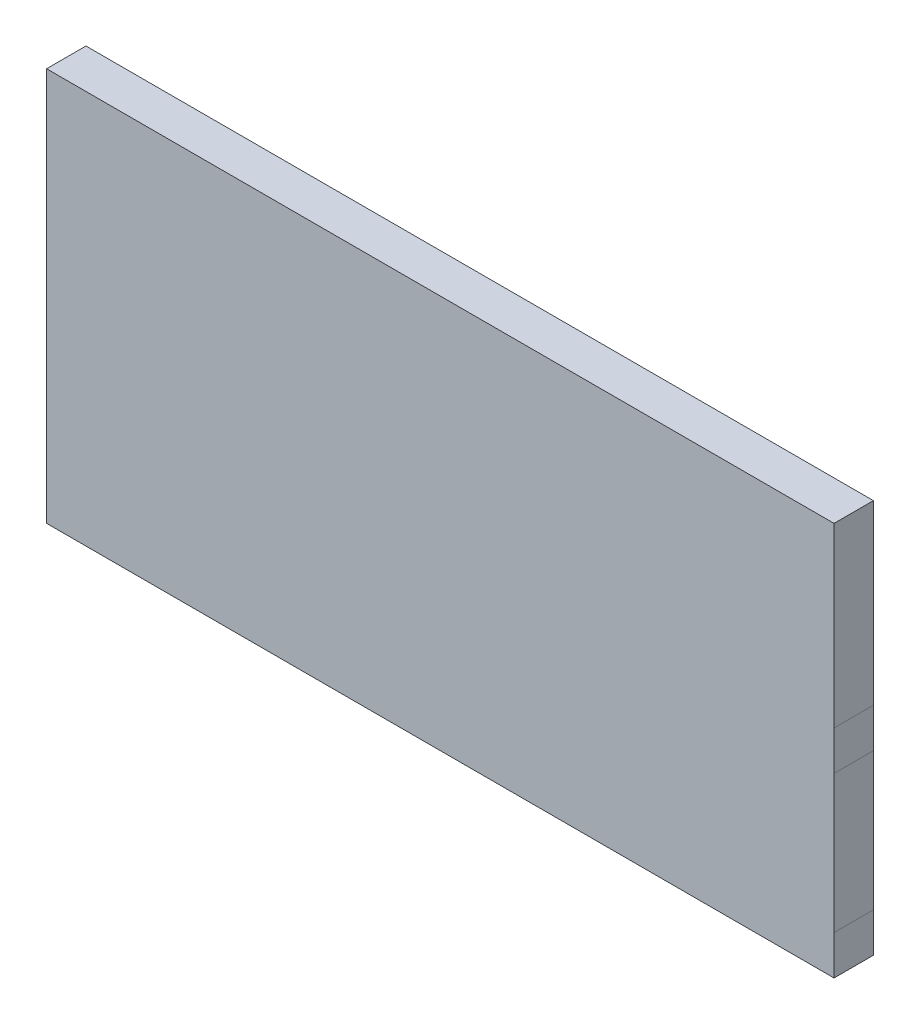
ISO-10303-21;
HEADER;
FILE_DESCRIPTION(('STEP AP214'),'2;1');
FILE_NAME('part.step','',(''),(''),'','','');
FILE_SCHEMA(('AUTOMOTIVE_DESIGN { 1 0 10303 214 1 1 1 1 }'));
ENDSEC;
DATA;
#1=APPLICATION_CONTEXT('core data for automotive mechanical design processes');
#2=APPLICATION_PROTOCOL_DEFINITION('international standard','automotive_design',2000,#1);
#3=PRODUCT_CONTEXT('',#1,'mechanical');
#4=PRODUCT('Part','Part','',(#3));
#5=PRODUCT_RELATED_PRODUCT_CATEGORY('part','',(#4));
#6=PRODUCT_DEFINITION_FORMATION('','',#4);
#7=PRODUCT_DEFINITION_CONTEXT('part definition',#1,'design');
#8=PRODUCT_DEFINITION('design','',#6,#7);
#9=PRODUCT_DEFINITION_SHAPE('','',#8);
#10=(LENGTH_UNIT() NAMED_UNIT(*) SI_UNIT(.MILLI.,.METRE.));
#11=(NAMED_UNIT(*) PLANE_ANGLE_UNIT() SI_UNIT($,.RADIAN.));
#12=(NAMED_UNIT(*) SI_UNIT($,.STERADIAN.) SOLID_ANGLE_UNIT());
#13=UNCERTAINTY_MEASURE_WITH_UNIT(LENGTH_MEASURE(1.E-05),#10,'distance_accuracy_value','');
#14=(GEOMETRIC_REPRESENTATION_CONTEXT(3) GLOBAL_UNCERTAINTY_ASSIGNED_CONTEXT((#13)) GLOBAL_UNIT_ASSIGNED_CONTEXT((#10,
#11,#12)) REPRESENTATION_CONTEXT('',''));
#15=CARTESIAN_POINT('',(0.,0.,0.));
#16=DIRECTION('',(0.,0.,1.));
#17=DIRECTION('',(1.,0.,0.));
#18=AXIS2_PLACEMENT_3D('',#15,#16,#17);
#19=CARTESIAN_POINT('',(2000.,0.,100.));
#20=DIRECTION('',(-1.,0.,0.));
#21=DIRECTION('',(0.,0.,1.));
#22=AXIS2_PLACEMENT_3D('',#19,#20,#21);
#23=PLANE('',#22);
#24=DIRECTION('',(0.,0.,-1.));
#25=VECTOR('',#24,1.);
#26=CARTESIAN_POINT('',(2000.,550.,100.));
#27=LINE('',#26,#25);
#28=CARTESIAN_POINT('',(2000.,550.,100.));
#29=VERTEX_POINT('',#28);
#30=CARTESIAN_POINT('',(2000.,550.,0.));
#31=VERTEX_POINT('',#30);
#32=EDGE_CURVE('E11',#29,#31,#27,.T.);
#33=ORIENTED_EDGE('',*,*,#32,.F.);
#34=DIRECTION('',(0.,1.,0.));
#35=VECTOR('',#34,1.);
#36=CARTESIAN_POINT('',(2000.,0.,100.));
#37=LINE('',#36,#35);
#38=CARTESIAN_POINT('',(2000.,450.,100.));
#39=VERTEX_POINT('',#38);
#40=EDGE_CURVE('E134',#39,#29,#37,.T.);
#41=ORIENTED_EDGE('',*,*,#40,.F.);
#42=DIRECTION('',(0.,0.,-1.));
#43=VECTOR('',#42,1.);
#44=CARTESIAN_POINT('',(2000.,450.,100.));
#45=LINE('',#44,#43);
#46=CARTESIAN_POINT('',(2000.,450.,0.));
#47=VERTEX_POINT('',#46);
#48=EDGE_CURVE('E48',#39,#47,#45,.T.);
#49=ORIENTED_EDGE('',*,*,#48,.T.);
#50=DIRECTION('',(0.,1.,0.));
#51=VECTOR('',#50,1.);
#52=CARTESIAN_POINT('',(2000.,0.,0.));
#53=LINE('',#52,#51);
#54=EDGE_CURVE('E132',#47,#31,#53,.T.);
#55=ORIENTED_EDGE('',*,*,#54,.T.);
#56=EDGE_LOOP('',(#33,#41,#49,#55));
#57=FACE_BOUND('',#56,.T.);
#58=ADVANCED_FACE('F39',(#57),#23,.F.);
#59=ORIENTED_EDGE('',*,*,#48,.F.);
#60=CARTESIAN_POINT('',(2000.,100.,100.));
#61=VERTEX_POINT('',#60);
#62=EDGE_CURVE('E163',#61,#39,#37,.T.);
#63=ORIENTED_EDGE('',*,*,#62,.F.);
#64=DIRECTION('',(0.,0.,-1.));
#65=VECTOR('',#64,1.);
#66=CARTESIAN_POINT('',(2000.,100.,100.));
#67=LINE('',#66,#65);
#68=CARTESIAN_POINT('',(2000.,100.,0.));
#69=VERTEX_POINT('',#68);
#70=EDGE_CURVE('E121',#61,#69,#67,.T.);
#71=ORIENTED_EDGE('',*,*,#70,.T.);
#72=EDGE_CURVE('E143',#69,#47,#53,.T.);
#73=ORIENTED_EDGE('',*,*,#72,.T.);
#74=EDGE_LOOP('',(#59,#63,#71,#73));
#75=FACE_BOUND('',#74,.T.);
#76=ADVANCED_FACE('F148',(#75),#23,.F.);
#77=ORIENTED_EDGE('',*,*,#70,.F.);
#78=CARTESIAN_POINT('',(2000.,0.,100.));
#79=VERTEX_POINT('',#78);
#80=EDGE_CURVE('E162',#79,#61,#37,.T.);
#81=ORIENTED_EDGE('',*,*,#80,.F.);
#82=DIRECTION('',(0.,0.,-1.));
#83=VECTOR('',#82,1.);
#84=CARTESIAN_POINT('',(2000.,0.,100.));
#85=LINE('',#84,#83);
#86=CARTESIAN_POINT('',(2000.,0.,0.));
#87=VERTEX_POINT('',#86);
#88=EDGE_CURVE('E103',#79,#87,#85,.T.);
#89=ORIENTED_EDGE('',*,*,#88,.T.);
#90=EDGE_CURVE('E149',#87,#69,#53,.T.);
#91=ORIENTED_EDGE('',*,*,#90,.T.);
#92=EDGE_LOOP('',(#77,#81,#89,#91));
#93=FACE_BOUND('',#92,.T.);
#94=ADVANCED_FACE('F167',(#93),#23,.F.);
#95=CARTESIAN_POINT('',(0.,0.,100.));
#96=DIRECTION('',(1.,0.,0.));
#97=DIRECTION('',(0.,0.,-1.));
#98=AXIS2_PLACEMENT_3D('',#95,#96,#97);
#99=PLANE('',#98);
#100=DIRECTION('',(0.,-1.,0.));
#101=VECTOR('',#100,1.);
#102=CARTESIAN_POINT('',(0.,0.,0.));
#103=LINE('',#102,#101);
#104=CARTESIAN_POINT('',(0.,1000.,0.));
#105=VERTEX_POINT('',#104);
#106=CARTESIAN_POINT('',(0.,0.,0.));
#107=VERTEX_POINT('',#106);
#108=EDGE_CURVE('E120',#105,#107,#103,.T.);
#109=ORIENTED_EDGE('',*,*,#108,.T.);
#110=DIRECTION('',(0.,0.,-1.));
#111=VECTOR('',#110,1.);
#112=CARTESIAN_POINT('',(0.,0.,100.));
#113=LINE('',#112,#111);
#114=CARTESIAN_POINT('',(0.,0.,100.));
#115=VERTEX_POINT('',#114);
#116=EDGE_CURVE('E100',#115,#107,#113,.T.);
#117=ORIENTED_EDGE('',*,*,#116,.F.);
#118=DIRECTION('',(0.,-1.,0.));
#119=VECTOR('',#118,1.);
#120=CARTESIAN_POINT('',(0.,0.,100.));
#121=LINE('',#120,#119);
#122=CARTESIAN_POINT('',(0.,1000.,100.));
#123=VERTEX_POINT('',#122);
#124=EDGE_CURVE('E108',#123,#115,#121,.T.);
#125=ORIENTED_EDGE('',*,*,#124,.F.);
#126=DIRECTION('',(0.,0.,-1.));
#127=VECTOR('',#126,1.);
#128=CARTESIAN_POINT('',(0.,1000.,100.));
#129=LINE('',#128,#127);
#130=EDGE_CURVE('E155',#123,#105,#129,.T.);
#131=ORIENTED_EDGE('',*,*,#130,.T.);
#132=EDGE_LOOP('',(#109,#117,#125,#131));
#133=FACE_BOUND('',#132,.T.);
#134=ADVANCED_FACE('F41',(#133),#99,.F.);
#135=CARTESIAN_POINT('',(0.,0.,100.));
#136=DIRECTION('',(0.,1.,0.));
#137=DIRECTION('',(0.,0.,1.));
#138=AXIS2_PLACEMENT_3D('',#135,#136,#137);
#139=PLANE('',#138);
#140=DIRECTION('',(1.,0.,0.));
#141=VECTOR('',#140,1.);
#142=CARTESIAN_POINT('',(0.,0.,0.));
#143=LINE('',#142,#141);
#144=EDGE_CURVE('E152',#107,#87,#143,.T.);
#145=ORIENTED_EDGE('',*,*,#144,.T.);
#146=ORIENTED_EDGE('',*,*,#88,.F.);
#147=DIRECTION('',(1.,0.,0.));
#148=VECTOR('',#147,1.);
#149=CARTESIAN_POINT('',(0.,0.,100.));
#150=LINE('',#149,#148);
#151=EDGE_CURVE('E96',#115,#79,#150,.T.);
#152=ORIENTED_EDGE('',*,*,#151,.F.);
#153=ORIENTED_EDGE('',*,*,#116,.T.);
#154=EDGE_LOOP('',(#145,#146,#152,#153));
#155=FACE_BOUND('',#154,.T.);
#156=ADVANCED_FACE('F98',(#155),#139,.F.);
#157=CARTESIAN_POINT('',(2000.,1000.,100.));
#158=VERTEX_POINT('',#157);
#159=EDGE_CURVE('E107',#29,#158,#37,.T.);
#160=ORIENTED_EDGE('',*,*,#159,.F.);
#161=ORIENTED_EDGE('',*,*,#32,.T.);
#162=CARTESIAN_POINT('',(2000.,1000.,0.));
#163=VERTEX_POINT('',#162);
#164=EDGE_CURVE('E146',#31,#163,#53,.T.);
#165=ORIENTED_EDGE('',*,*,#164,.T.);
#166=DIRECTION('',(0.,0.,-1.));
#167=VECTOR('',#166,1.);
#168=CARTESIAN_POINT('',(2000.,1000.,100.));
#169=LINE('',#168,#167);
#170=EDGE_CURVE('E125',#158,#163,#169,.T.);
#171=ORIENTED_EDGE('',*,*,#170,.F.);
#172=EDGE_LOOP('',(#160,#161,#165,#171));
#173=FACE_BOUND('',#172,.T.);
#174=ADVANCED_FACE('F164',(#173),#23,.F.);
#175=CARTESIAN_POINT('',(0.,1000.,100.));
#176=DIRECTION('',(0.,-1.,0.));
#177=DIRECTION('',(0.,0.,-1.));
#178=AXIS2_PLACEMENT_3D('',#175,#176,#177);
#179=PLANE('',#178);
#180=DIRECTION('',(-1.,0.,0.));
#181=VECTOR('',#180,1.);
#182=CARTESIAN_POINT('',(0.,1000.,0.));
#183=LINE('',#182,#181);
#184=EDGE_CURVE('E117',#163,#105,#183,.T.);
#185=ORIENTED_EDGE('',*,*,#184,.T.);
#186=ORIENTED_EDGE('',*,*,#130,.F.);
#187=DIRECTION('',(-1.,0.,0.));
#188=VECTOR('',#187,1.);
#189=CARTESIAN_POINT('',(0.,1000.,100.));
#190=LINE('',#189,#188);
#191=EDGE_CURVE('E113',#158,#123,#190,.T.);
#192=ORIENTED_EDGE('',*,*,#191,.F.);
#193=ORIENTED_EDGE('',*,*,#170,.T.);
#194=EDGE_LOOP('',(#185,#186,#192,#193));
#195=FACE_BOUND('',#194,.T.);
#196=ADVANCED_FACE('F159',(#195),#179,.F.);
#197=CARTESIAN_POINT('',(0.,0.,100.));
#198=DIRECTION('',(0.,0.,-1.));
#199=DIRECTION('',(-1.,0.,0.));
#200=AXIS2_PLACEMENT_3D('',#197,#198,#199);
#201=PLANE('',#200);
#202=ORIENTED_EDGE('',*,*,#124,.T.);
#203=ORIENTED_EDGE('',*,*,#151,.T.);
#204=ORIENTED_EDGE('',*,*,#80,.T.);
#205=ORIENTED_EDGE('',*,*,#62,.T.);
#206=ORIENTED_EDGE('',*,*,#40,.T.);
#207=ORIENTED_EDGE('',*,*,#159,.T.);
#208=ORIENTED_EDGE('',*,*,#191,.T.);
#209=EDGE_LOOP('',(#202,#203,#204,#205,#206,#207,#208));
#210=FACE_BOUND('',#209,.T.);
#211=ADVANCED_FACE('F111',(#210),#201,.F.);
#212=CARTESIAN_POINT('',(0.,0.,0.));
#213=DIRECTION('',(0.,0.,-1.));
#214=DIRECTION('',(-1.,0.,0.));
#215=AXIS2_PLACEMENT_3D('',#212,#213,#214);
#216=PLANE('',#215);
#217=ORIENTED_EDGE('',*,*,#108,.F.);
#218=ORIENTED_EDGE('',*,*,#184,.F.);
#219=ORIENTED_EDGE('',*,*,#164,.F.);
#220=ORIENTED_EDGE('',*,*,#54,.F.);
#221=ORIENTED_EDGE('',*,*,#72,.F.);
#222=ORIENTED_EDGE('',*,*,#90,.F.);
#223=ORIENTED_EDGE('',*,*,#144,.F.);
#224=EDGE_LOOP('',(#217,#218,#219,#220,#221,#222,#223));
#225=FACE_BOUND('',#224,.T.);
#226=ADVANCED_FACE('F141',(#225),#216,.T.);
#227=CLOSED_SHELL('',(#58,#76,#94,#134,#156,#174,#196,#211,#226));
#228=MANIFOLD_SOLID_BREP('B2',#227);
#229=ADVANCED_BREP_SHAPE_REPRESENTATION('',(#18,#228),#14);
#230=SHAPE_DEFINITION_REPRESENTATION(#9,#229);
ENDSEC;
END-ISO-10303-21;
